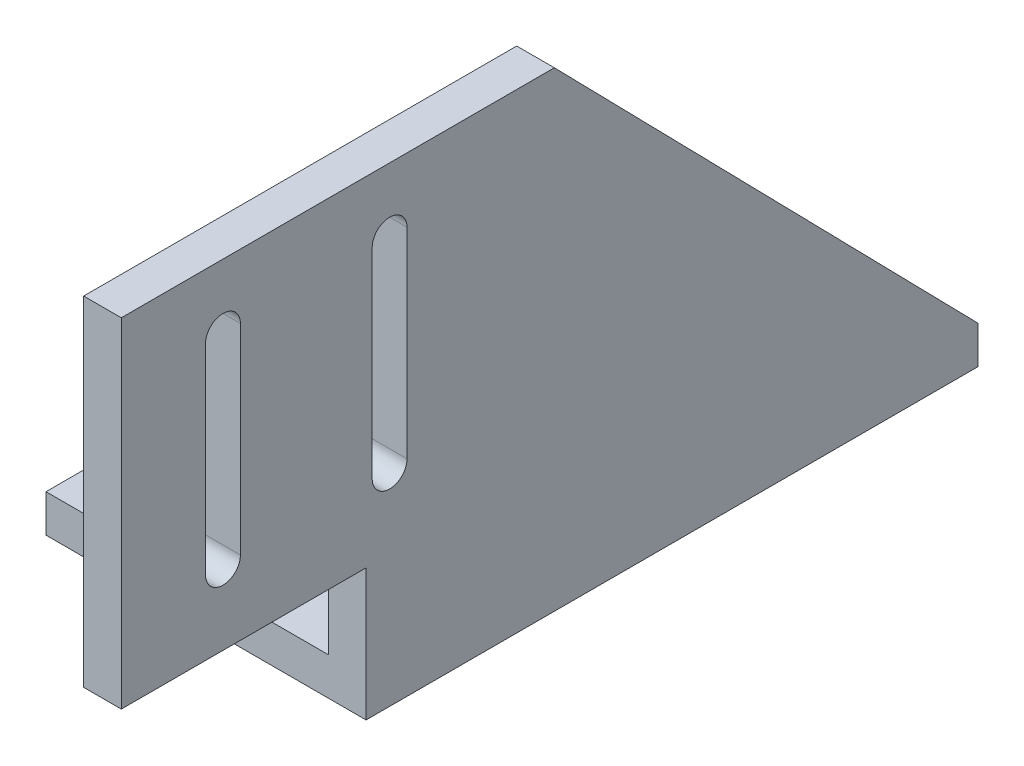
ISO-10303-21;
HEADER;
FILE_DESCRIPTION(('STEP AP214'),'2;1');
FILE_NAME('part.step','',(''),(''),'','','');
FILE_SCHEMA(('AUTOMOTIVE_DESIGN { 1 0 10303 214 1 1 1 1 }'));
ENDSEC;
DATA;
#1=APPLICATION_CONTEXT('core data for automotive mechanical design processes');
#2=APPLICATION_PROTOCOL_DEFINITION('international standard','automotive_design',2000,#1);
#3=PRODUCT_CONTEXT('',#1,'mechanical');
#4=PRODUCT('Part','Part','',(#3));
#5=PRODUCT_RELATED_PRODUCT_CATEGORY('part','',(#4));
#6=PRODUCT_DEFINITION_FORMATION('','',#4);
#7=PRODUCT_DEFINITION_CONTEXT('part definition',#1,'design');
#8=PRODUCT_DEFINITION('design','',#6,#7);
#9=PRODUCT_DEFINITION_SHAPE('','',#8);
#10=(LENGTH_UNIT() NAMED_UNIT(*) SI_UNIT(.MILLI.,.METRE.));
#11=(NAMED_UNIT(*) PLANE_ANGLE_UNIT() SI_UNIT($,.RADIAN.));
#12=(NAMED_UNIT(*) SI_UNIT($,.STERADIAN.) SOLID_ANGLE_UNIT());
#13=UNCERTAINTY_MEASURE_WITH_UNIT(LENGTH_MEASURE(1.E-05),#10,'distance_accuracy_value','');
#14=(GEOMETRIC_REPRESENTATION_CONTEXT(3) GLOBAL_UNCERTAINTY_ASSIGNED_CONTEXT((#13)) GLOBAL_UNIT_ASSIGNED_CONTEXT((#10,
#11,#12)) REPRESENTATION_CONTEXT('',''));
#15=CARTESIAN_POINT('',(0.,0.,0.));
#16=DIRECTION('',(0.,0.,1.));
#17=DIRECTION('',(1.,0.,0.));
#18=AXIS2_PLACEMENT_3D('',#15,#16,#17);
#19=CARTESIAN_POINT('',(0.,-2.,32.5));
#20=DIRECTION('',(1.,0.,0.));
#21=DIRECTION('',(0.,0.,-1.));
#22=AXIS2_PLACEMENT_3D('',#19,#20,#21);
#23=PLANE('',#22);
#24=DIRECTION('',(0.,-1.,0.));
#25=VECTOR('',#24,1.);
#26=CARTESIAN_POINT('',(0.,-2.,0.));
#27=LINE('',#26,#25);
#28=CARTESIAN_POINT('',(0.,0.,0.));
#29=VERTEX_POINT('',#28);
#30=CARTESIAN_POINT('',(0.,-2.,0.));
#31=VERTEX_POINT('',#30);
#32=EDGE_CURVE('E197',#29,#31,#27,.T.);
#33=ORIENTED_EDGE('',*,*,#32,.T.);
#34=DIRECTION('',(0.,0.,-1.));
#35=VECTOR('',#34,1.);
#36=CARTESIAN_POINT('',(0.,-2.,32.5));
#37=LINE('',#36,#35);
#38=CARTESIAN_POINT('',(0.,-2.,32.5));
#39=VERTEX_POINT('',#38);
#40=EDGE_CURVE('E11',#39,#31,#37,.T.);
#41=ORIENTED_EDGE('',*,*,#40,.F.);
#42=DIRECTION('',(0.,-1.,0.));
#43=VECTOR('',#42,1.);
#44=CARTESIAN_POINT('',(0.,-2.,32.5));
#45=LINE('',#44,#43);
#46=CARTESIAN_POINT('',(0.,0.,32.5));
#47=VERTEX_POINT('',#46);
#48=EDGE_CURVE('E163',#47,#39,#45,.T.);
#49=ORIENTED_EDGE('',*,*,#48,.F.);
#50=DIRECTION('',(0.,0.,-1.));
#51=VECTOR('',#50,1.);
#52=CARTESIAN_POINT('',(0.,0.,32.5));
#53=LINE('',#52,#51);
#54=EDGE_CURVE('E189',#47,#29,#53,.T.);
#55=ORIENTED_EDGE('',*,*,#54,.T.);
#56=EDGE_LOOP('',(#33,#41,#49,#55));
#57=FACE_BOUND('',#56,.T.);
#58=ADVANCED_FACE('F43',(#57),#23,.F.);
#59=CARTESIAN_POINT('',(17.,-1.99999999999999,32.5));
#60=DIRECTION('',(0.,1.,0.));
#61=DIRECTION('',(-1.,0.,0.));
#62=AXIS2_PLACEMENT_3D('',#59,#60,#61);
#63=PLANE('',#62);
#64=CARTESIAN_POINT('',(8.,-2.,25.25));
#65=DIRECTION('',(0.,-1.,0.));
#66=DIRECTION('',(1.,0.,0.));
#67=AXIS2_PLACEMENT_3D('',#64,#65,#66);
#68=CIRCLE('',#67,2.75);
#69=CARTESIAN_POINT('',(10.75,-2.,25.25));
#70=VERTEX_POINT('',#69);
#71=EDGE_CURVE('E206',#70,#70,#68,.T.);
#72=ORIENTED_EDGE('',*,*,#71,.F.);
#73=EDGE_LOOP('',(#72));
#74=FACE_BOUND('',#73,.T.);
#75=CARTESIAN_POINT('',(8.,-2.,7.25));
#76=DIRECTION('',(0.,-1.,0.));
#77=DIRECTION('',(1.,0.,0.));
#78=AXIS2_PLACEMENT_3D('',#75,#76,#77);
#79=CIRCLE('',#78,2.75);
#80=CARTESIAN_POINT('',(10.75,-2.,7.25));
#81=VERTEX_POINT('',#80);
#82=EDGE_CURVE('E203',#81,#81,#79,.T.);
#83=ORIENTED_EDGE('',*,*,#82,.F.);
#84=EDGE_LOOP('',(#83));
#85=FACE_BOUND('',#84,.T.);
#86=DIRECTION('',(0.,0.,-1.));
#87=VECTOR('',#86,1.);
#88=CARTESIAN_POINT('',(17.,-1.99999999999999,32.5));
#89=LINE('',#88,#87);
#90=CARTESIAN_POINT('',(17.,-1.99999999999999,32.5));
#91=VERTEX_POINT('',#90);
#92=CARTESIAN_POINT('',(17.,-1.99999999999999,0.));
#93=VERTEX_POINT('',#92);
#94=EDGE_CURVE('E50',#91,#93,#89,.T.);
#95=ORIENTED_EDGE('',*,*,#94,.F.);
#96=DIRECTION('',(1.,0.,0.));
#97=VECTOR('',#96,1.);
#98=CARTESIAN_POINT('',(17.,-1.99999999999999,32.5));
#99=LINE('',#98,#97);
#100=EDGE_CURVE('E158',#39,#91,#99,.T.);
#101=ORIENTED_EDGE('',*,*,#100,.F.);
#102=ORIENTED_EDGE('',*,*,#40,.T.);
#103=DIRECTION('',(1.,0.,0.));
#104=VECTOR('',#103,1.);
#105=CARTESIAN_POINT('',(17.,-1.99999999999999,0.));
#106=LINE('',#105,#104);
#107=EDGE_CURVE('E177',#31,#93,#106,.T.);
#108=ORIENTED_EDGE('',*,*,#107,.T.);
#109=EDGE_LOOP('',(#95,#101,#102,#108));
#110=FACE_BOUND('',#109,.T.);
#111=ADVANCED_FACE('F176',(#74,#85,#110),#63,.F.);
#112=CARTESIAN_POINT('',(17.,23.,32.5));
#113=DIRECTION('',(-1.,0.,0.));
#114=DIRECTION('',(0.,-1.,0.));
#115=AXIS2_PLACEMENT_3D('',#112,#113,#114);
#116=PLANE('',#115);
#117=DIRECTION('',(0.,1.,0.));
#118=VECTOR('',#117,1.);
#119=CARTESIAN_POINT('',(17.,8.92500000000001,39.175));
#120=LINE('',#119,#118);
#121=CARTESIAN_POINT('',(17.,8.92500000000001,39.175));
#122=VERTEX_POINT('',#121);
#123=CARTESIAN_POINT('',(17.,19.575,39.175));
#124=VERTEX_POINT('',#123);
#125=EDGE_CURVE('E282',#122,#124,#120,.T.);
#126=ORIENTED_EDGE('',*,*,#125,.F.);
#127=CARTESIAN_POINT('',(17.,8.92500000000001,40.1));
#128=DIRECTION('',(1.,0.,0.));
#129=DIRECTION('',(0.,1.,0.));
#130=AXIS2_PLACEMENT_3D('',#127,#128,#129);
#131=CIRCLE('',#130,0.925000000000009);
#132=CARTESIAN_POINT('',(17.,8.92500000000001,41.025));
#133=VERTEX_POINT('',#132);
#134=EDGE_CURVE('E65',#133,#122,#131,.T.);
#135=ORIENTED_EDGE('',*,*,#134,.F.);
#136=DIRECTION('',(0.,-1.,0.));
#137=VECTOR('',#136,1.);
#138=CARTESIAN_POINT('',(17.,8.92500000000001,41.025));
#139=LINE('',#138,#137);
#140=CARTESIAN_POINT('',(17.,19.575,41.025));
#141=VERTEX_POINT('',#140);
#142=EDGE_CURVE('E272',#141,#133,#139,.T.);
#143=ORIENTED_EDGE('',*,*,#142,.F.);
#144=CARTESIAN_POINT('',(17.,19.575,40.1));
#145=DIRECTION('',(1.,0.,0.));
#146=DIRECTION('',(0.,1.,0.));
#147=AXIS2_PLACEMENT_3D('',#144,#145,#146);
#148=CIRCLE('',#147,0.925000000000009);
#149=EDGE_CURVE('E279',#124,#141,#148,.T.);
#150=ORIENTED_EDGE('',*,*,#149,.F.);
#151=EDGE_LOOP('',(#126,#135,#143,#150));
#152=FACE_BOUND('',#151,.T.);
#153=DIRECTION('',(0.,1.,0.));
#154=VECTOR('',#153,1.);
#155=CARTESIAN_POINT('',(17.,8.92500000000001,30.325));
#156=LINE('',#155,#154);
#157=CARTESIAN_POINT('',(17.,8.92500000000001,30.325));
#158=VERTEX_POINT('',#157);
#159=CARTESIAN_POINT('',(17.,19.575,30.325));
#160=VERTEX_POINT('',#159);
#161=EDGE_CURVE('E244',#158,#160,#156,.T.);
#162=ORIENTED_EDGE('',*,*,#161,.F.);
#163=CARTESIAN_POINT('',(17.,8.92500000000001,31.25));
#164=DIRECTION('',(1.,0.,0.));
#165=DIRECTION('',(0.,1.,0.));
#166=AXIS2_PLACEMENT_3D('',#163,#164,#165);
#167=CIRCLE('',#166,0.925000000000002);
#168=CARTESIAN_POINT('',(17.,8.92500000000001,32.175));
#169=VERTEX_POINT('',#168);
#170=EDGE_CURVE('E242',#169,#158,#167,.T.);
#171=ORIENTED_EDGE('',*,*,#170,.F.);
#172=DIRECTION('',(0.,-1.,0.));
#173=VECTOR('',#172,1.);
#174=CARTESIAN_POINT('',(17.,8.92500000000001,32.175));
#175=LINE('',#174,#173);
#176=CARTESIAN_POINT('',(17.,19.575,32.175));
#177=VERTEX_POINT('',#176);
#178=EDGE_CURVE('E250',#177,#169,#175,.T.);
#179=ORIENTED_EDGE('',*,*,#178,.F.);
#180=CARTESIAN_POINT('',(17.,19.575,31.25));
#181=DIRECTION('',(1.,0.,0.));
#182=DIRECTION('',(0.,1.,0.));
#183=AXIS2_PLACEMENT_3D('',#180,#181,#182);
#184=CIRCLE('',#183,0.925000000000002);
#185=EDGE_CURVE('E247',#160,#177,#184,.T.);
#186=ORIENTED_EDGE('',*,*,#185,.F.);
#187=EDGE_LOOP('',(#162,#171,#179,#186));
#188=FACE_BOUND('',#187,.T.);
#189=DIRECTION('',(0.,-1.,0.));
#190=VECTOR('',#189,1.);
#191=CARTESIAN_POINT('',(17.,-1.99999999999999,45.5));
#192=LINE('',#191,#190);
#193=CARTESIAN_POINT('',(17.,23.,45.5));
#194=VERTEX_POINT('',#193);
#195=CARTESIAN_POINT('',(17.,5.00000000000001,45.5));
#196=VERTEX_POINT('',#195);
#197=EDGE_CURVE('E228',#194,#196,#192,.T.);
#198=ORIENTED_EDGE('',*,*,#197,.T.);
#199=DIRECTION('',(0.,0.,1.));
#200=VECTOR('',#199,1.);
#201=CARTESIAN_POINT('',(17.,5.00000000000001,45.5));
#202=LINE('',#201,#200);
#203=CARTESIAN_POINT('',(17.,5.00000000000001,32.5));
#204=VERTEX_POINT('',#203);
#205=EDGE_CURVE('E57',#204,#196,#202,.T.);
#206=ORIENTED_EDGE('',*,*,#205,.F.);
#207=DIRECTION('',(0.,1.,0.));
#208=VECTOR('',#207,1.);
#209=CARTESIAN_POINT('',(17.,-1.99999999999999,32.5));
#210=LINE('',#209,#208);
#211=EDGE_CURVE('E161',#91,#204,#210,.T.);
#212=ORIENTED_EDGE('',*,*,#211,.F.);
#213=ORIENTED_EDGE('',*,*,#94,.T.);
#214=DIRECTION('',(0.,1.,0.));
#215=VECTOR('',#214,1.);
#216=CARTESIAN_POINT('',(17.,23.,0.));
#217=LINE('',#216,#215);
#218=CARTESIAN_POINT('',(17.,0.,0.));
#219=VERTEX_POINT('',#218);
#220=EDGE_CURVE('E194',#93,#219,#217,.T.);
#221=ORIENTED_EDGE('',*,*,#220,.T.);
#222=DIRECTION('',(0.,-0.714834025585147,-0.699294155463731));
#223=VECTOR('',#222,1.);
#224=CARTESIAN_POINT('',(17.,23.,22.5));
#225=LINE('',#224,#223);
#226=CARTESIAN_POINT('',(17.,23.,22.5));
#227=VERTEX_POINT('',#226);
#228=EDGE_CURVE('E220',#227,#219,#225,.T.);
#229=ORIENTED_EDGE('',*,*,#228,.F.);
#230=DIRECTION('',(0.,0.,-1.));
#231=VECTOR('',#230,1.);
#232=CARTESIAN_POINT('',(17.,23.,32.5));
#233=LINE('',#232,#231);
#234=EDGE_CURVE('E179',#194,#227,#233,.T.);
#235=ORIENTED_EDGE('',*,*,#234,.F.);
#236=EDGE_LOOP('',(#198,#206,#212,#213,#221,#229,#235));
#237=FACE_BOUND('',#236,.T.);
#238=ADVANCED_FACE('F171',(#152,#188,#237),#116,.F.);
#239=CARTESIAN_POINT('',(15.,23.,32.5));
#240=DIRECTION('',(0.,-1.,0.));
#241=DIRECTION('',(0.,0.,-1.));
#242=AXIS2_PLACEMENT_3D('',#239,#240,#241);
#243=PLANE('',#242);
#244=ORIENTED_EDGE('',*,*,#234,.T.);
#245=DIRECTION('',(1.,0.,0.));
#246=VECTOR('',#245,1.);
#247=CARTESIAN_POINT('',(15.,23.,22.5));
#248=LINE('',#247,#246);
#249=CARTESIAN_POINT('',(15.,23.,22.5));
#250=VERTEX_POINT('',#249);
#251=EDGE_CURVE('E215',#250,#227,#248,.T.);
#252=ORIENTED_EDGE('',*,*,#251,.F.);
#253=DIRECTION('',(0.,0.,-1.));
#254=VECTOR('',#253,1.);
#255=CARTESIAN_POINT('',(15.,23.,32.5));
#256=LINE('',#255,#254);
#257=CARTESIAN_POINT('',(15.,23.,45.5));
#258=VERTEX_POINT('',#257);
#259=EDGE_CURVE('E181',#258,#250,#256,.T.);
#260=ORIENTED_EDGE('',*,*,#259,.F.);
#261=DIRECTION('',(1.,0.,0.));
#262=VECTOR('',#261,1.);
#263=CARTESIAN_POINT('',(15.,23.,45.5));
#264=LINE('',#263,#262);
#265=EDGE_CURVE('E222',#258,#194,#264,.T.);
#266=ORIENTED_EDGE('',*,*,#265,.T.);
#267=EDGE_LOOP('',(#244,#252,#260,#266));
#268=FACE_BOUND('',#267,.T.);
#269=ADVANCED_FACE('F320',(#268),#243,.F.);
#270=CARTESIAN_POINT('',(15.,0.,32.5));
#271=DIRECTION('',(1.,0.,0.));
#272=DIRECTION('',(0.,0.,-1.));
#273=AXIS2_PLACEMENT_3D('',#270,#271,#272);
#274=PLANE('',#273);
#275=DIRECTION('',(0.,1.,0.));
#276=VECTOR('',#275,1.);
#277=CARTESIAN_POINT('',(15.,8.92500000000001,41.025));
#278=LINE('',#277,#276);
#279=CARTESIAN_POINT('',(15.,8.92500000000001,41.025));
#280=VERTEX_POINT('',#279);
#281=CARTESIAN_POINT('',(15.,19.575,41.025));
#282=VERTEX_POINT('',#281);
#283=EDGE_CURVE('E289',#280,#282,#278,.T.);
#284=ORIENTED_EDGE('',*,*,#283,.F.);
#285=CARTESIAN_POINT('',(15.,8.92500000000001,40.1));
#286=DIRECTION('',(1.,0.,0.));
#287=DIRECTION('',(0.,0.,-1.));
#288=AXIS2_PLACEMENT_3D('',#285,#286,#287);
#289=CIRCLE('',#288,0.925000000000009);
#290=CARTESIAN_POINT('',(15.,8.92500000000001,39.175));
#291=VERTEX_POINT('',#290);
#292=EDGE_CURVE('E286',#291,#280,#289,.F.);
#293=ORIENTED_EDGE('',*,*,#292,.F.);
#294=DIRECTION('',(0.,-1.,0.));
#295=VECTOR('',#294,1.);
#296=CARTESIAN_POINT('',(15.,8.92500000000001,39.175));
#297=LINE('',#296,#295);
#298=CARTESIAN_POINT('',(15.,19.575,39.175));
#299=VERTEX_POINT('',#298);
#300=EDGE_CURVE('E230',#299,#291,#297,.T.);
#301=ORIENTED_EDGE('',*,*,#300,.F.);
#302=CARTESIAN_POINT('',(15.,19.575,40.1));
#303=DIRECTION('',(1.,0.,0.));
#304=DIRECTION('',(0.,0.,-1.));
#305=AXIS2_PLACEMENT_3D('',#302,#303,#304);
#306=CIRCLE('',#305,0.925000000000009);
#307=EDGE_CURVE('E235',#282,#299,#306,.F.);
#308=ORIENTED_EDGE('',*,*,#307,.F.);
#309=EDGE_LOOP('',(#284,#293,#301,#308));
#310=FACE_BOUND('',#309,.T.);
#311=DIRECTION('',(0.,1.,0.));
#312=VECTOR('',#311,1.);
#313=CARTESIAN_POINT('',(15.,8.92500000000001,32.175));
#314=LINE('',#313,#312);
#315=CARTESIAN_POINT('',(15.,8.92500000000001,32.175));
#316=VERTEX_POINT('',#315);
#317=CARTESIAN_POINT('',(15.,19.575,32.175));
#318=VERTEX_POINT('',#317);
#319=EDGE_CURVE('E236',#316,#318,#314,.T.);
#320=ORIENTED_EDGE('',*,*,#319,.F.);
#321=CARTESIAN_POINT('',(15.,8.92500000000001,31.25));
#322=DIRECTION('',(1.,0.,0.));
#323=DIRECTION('',(0.,0.,-1.));
#324=AXIS2_PLACEMENT_3D('',#321,#322,#323);
#325=CIRCLE('',#324,0.925000000000002);
#326=CARTESIAN_POINT('',(15.,8.92500000000001,30.325));
#327=VERTEX_POINT('',#326);
#328=EDGE_CURVE('E239',#327,#316,#325,.F.);
#329=ORIENTED_EDGE('',*,*,#328,.F.);
#330=DIRECTION('',(0.,-1.,0.));
#331=VECTOR('',#330,1.);
#332=CARTESIAN_POINT('',(15.,8.92500000000001,30.325));
#333=LINE('',#332,#331);
#334=CARTESIAN_POINT('',(15.,19.575,30.325));
#335=VERTEX_POINT('',#334);
#336=EDGE_CURVE('E257',#335,#327,#333,.T.);
#337=ORIENTED_EDGE('',*,*,#336,.F.);
#338=CARTESIAN_POINT('',(15.,19.575,31.25));
#339=DIRECTION('',(1.,0.,0.));
#340=DIRECTION('',(0.,0.,-1.));
#341=AXIS2_PLACEMENT_3D('',#338,#339,#340);
#342=CIRCLE('',#341,0.925000000000002);
#343=EDGE_CURVE('E233',#318,#335,#342,.F.);
#344=ORIENTED_EDGE('',*,*,#343,.F.);
#345=EDGE_LOOP('',(#320,#329,#337,#344));
#346=FACE_BOUND('',#345,.T.);
#347=DIRECTION('',(0.,-1.,0.));
#348=VECTOR('',#347,1.);
#349=CARTESIAN_POINT('',(15.,-2.,32.5));
#350=LINE('',#349,#348);
#351=CARTESIAN_POINT('',(15.,5.00000000000001,32.5));
#352=VERTEX_POINT('',#351);
#353=CARTESIAN_POINT('',(15.,0.,32.5));
#354=VERTEX_POINT('',#353);
#355=EDGE_CURVE('E265',#352,#354,#350,.T.);
#356=ORIENTED_EDGE('',*,*,#355,.F.);
#357=DIRECTION('',(0.,0.,-1.));
#358=VECTOR('',#357,1.);
#359=CARTESIAN_POINT('',(15.,5.,45.5));
#360=LINE('',#359,#358);
#361=CARTESIAN_POINT('',(15.,5.,45.5));
#362=VERTEX_POINT('',#361);
#363=EDGE_CURVE('E174',#362,#352,#360,.T.);
#364=ORIENTED_EDGE('',*,*,#363,.F.);
#365=DIRECTION('',(0.,-1.,0.));
#366=VECTOR('',#365,1.);
#367=CARTESIAN_POINT('',(15.,-2.,45.5));
#368=LINE('',#367,#366);
#369=EDGE_CURVE('E227',#258,#362,#368,.T.);
#370=ORIENTED_EDGE('',*,*,#369,.F.);
#371=ORIENTED_EDGE('',*,*,#259,.T.);
#372=DIRECTION('',(0.,-0.714834025585147,-0.699294155463731));
#373=VECTOR('',#372,1.);
#374=CARTESIAN_POINT('',(15.,23.,22.5));
#375=LINE('',#374,#373);
#376=CARTESIAN_POINT('',(15.,0.,0.));
#377=VERTEX_POINT('',#376);
#378=EDGE_CURVE('E217',#250,#377,#375,.T.);
#379=ORIENTED_EDGE('',*,*,#378,.T.);
#380=DIRECTION('',(0.,0.,-1.));
#381=VECTOR('',#380,1.);
#382=CARTESIAN_POINT('',(15.,0.,32.5));
#383=LINE('',#382,#381);
#384=EDGE_CURVE('E186',#354,#377,#383,.T.);
#385=ORIENTED_EDGE('',*,*,#384,.F.);
#386=EDGE_LOOP('',(#356,#364,#370,#371,#379,#385));
#387=FACE_BOUND('',#386,.T.);
#388=ADVANCED_FACE('F306',(#310,#346,#387),#274,.F.);
#389=CARTESIAN_POINT('',(0.,0.,32.5));
#390=DIRECTION('',(0.,-1.,0.));
#391=DIRECTION('',(0.,0.,-1.));
#392=AXIS2_PLACEMENT_3D('',#389,#390,#391);
#393=PLANE('',#392);
#394=CARTESIAN_POINT('',(8.,0.,25.25));
#395=DIRECTION('',(0.,-1.,0.));
#396=DIRECTION('',(0.,0.,-1.));
#397=AXIS2_PLACEMENT_3D('',#394,#395,#396);
#398=CIRCLE('',#397,2.75);
#399=CARTESIAN_POINT('',(8.,0.,22.5));
#400=VERTEX_POINT('',#399);
#401=EDGE_CURVE('E200',#400,#400,#398,.F.);
#402=ORIENTED_EDGE('',*,*,#401,.F.);
#403=EDGE_LOOP('',(#402));
#404=FACE_BOUND('',#403,.T.);
#405=CARTESIAN_POINT('',(8.,0.,7.25));
#406=DIRECTION('',(0.,-1.,0.));
#407=DIRECTION('',(0.,0.,-1.));
#408=AXIS2_PLACEMENT_3D('',#405,#406,#407);
#409=CIRCLE('',#408,2.75);
#410=CARTESIAN_POINT('',(8.,0.,4.5));
#411=VERTEX_POINT('',#410);
#412=EDGE_CURVE('E207',#411,#411,#409,.F.);
#413=ORIENTED_EDGE('',*,*,#412,.F.);
#414=EDGE_LOOP('',(#413));
#415=FACE_BOUND('',#414,.T.);
#416=DIRECTION('',(-1.,0.,0.));
#417=VECTOR('',#416,1.);
#418=CARTESIAN_POINT('',(0.,0.,0.));
#419=LINE('',#418,#417);
#420=EDGE_CURVE('E192',#377,#29,#419,.T.);
#421=ORIENTED_EDGE('',*,*,#420,.T.);
#422=ORIENTED_EDGE('',*,*,#54,.F.);
#423=DIRECTION('',(-1.,0.,0.));
#424=VECTOR('',#423,1.);
#425=CARTESIAN_POINT('',(0.,0.,32.5));
#426=LINE('',#425,#424);
#427=EDGE_CURVE('E167',#354,#47,#426,.T.);
#428=ORIENTED_EDGE('',*,*,#427,.F.);
#429=ORIENTED_EDGE('',*,*,#384,.T.);
#430=EDGE_LOOP('',(#421,#422,#428,#429));
#431=FACE_BOUND('',#430,.T.);
#432=ADVANCED_FACE('F310',(#404,#415,#431),#393,.F.);
#433=CARTESIAN_POINT('',(0.,0.,32.5));
#434=DIRECTION('',(0.,0.,-1.));
#435=DIRECTION('',(-1.,0.,0.));
#436=AXIS2_PLACEMENT_3D('',#433,#434,#435);
#437=PLANE('',#436);
#438=ORIENTED_EDGE('',*,*,#100,.T.);
#439=ORIENTED_EDGE('',*,*,#211,.T.);
#440=DIRECTION('',(1.,0.,0.));
#441=VECTOR('',#440,1.);
#442=CARTESIAN_POINT('',(-0.001000000000001,5.,32.5));
#443=LINE('',#442,#441);
#444=EDGE_CURVE('E295',#352,#204,#443,.T.);
#445=ORIENTED_EDGE('',*,*,#444,.F.);
#446=ORIENTED_EDGE('',*,*,#355,.T.);
#447=ORIENTED_EDGE('',*,*,#427,.T.);
#448=ORIENTED_EDGE('',*,*,#48,.T.);
#449=EDGE_LOOP('',(#438,#439,#445,#446,#447,#448));
#450=FACE_BOUND('',#449,.T.);
#451=ADVANCED_FACE('F160',(#450),#437,.F.);
#452=CARTESIAN_POINT('',(0.,0.,0.));
#453=DIRECTION('',(0.,0.,-1.));
#454=DIRECTION('',(-1.,0.,0.));
#455=AXIS2_PLACEMENT_3D('',#452,#453,#454);
#456=PLANE('',#455);
#457=DIRECTION('',(1.,0.,0.));
#458=VECTOR('',#457,1.);
#459=CARTESIAN_POINT('',(15.,0.,0.));
#460=LINE('',#459,#458);
#461=EDGE_CURVE('E210',#377,#219,#460,.T.);
#462=ORIENTED_EDGE('',*,*,#461,.T.);
#463=ORIENTED_EDGE('',*,*,#220,.F.);
#464=ORIENTED_EDGE('',*,*,#107,.F.);
#465=ORIENTED_EDGE('',*,*,#32,.F.);
#466=ORIENTED_EDGE('',*,*,#420,.F.);
#467=EDGE_LOOP('',(#462,#463,#464,#465,#466));
#468=FACE_BOUND('',#467,.T.);
#469=ADVANCED_FACE('F315',(#468),#456,.T.);
#470=CARTESIAN_POINT('',(8.,7.77817459305202,7.25));
#471=DIRECTION('',(0.,-1.,0.));
#472=DIRECTION('',(1.,0.,0.));
#473=AXIS2_PLACEMENT_3D('',#470,#471,#472);
#474=CYLINDRICAL_SURFACE('',#473,2.75);
#475=ORIENTED_EDGE('',*,*,#412,.T.);
#476=EDGE_LOOP('',(#475));
#477=FACE_BOUND('',#476,.T.);
#478=ORIENTED_EDGE('',*,*,#82,.T.);
#479=EDGE_LOOP('',(#478));
#480=FACE_BOUND('',#479,.T.);
#481=ADVANCED_FACE('F337',(#477,#480),#474,.F.);
#482=CARTESIAN_POINT('',(8.,7.77817459305202,25.25));
#483=DIRECTION('',(0.,-1.,0.));
#484=DIRECTION('',(1.,0.,0.));
#485=AXIS2_PLACEMENT_3D('',#482,#483,#484);
#486=CYLINDRICAL_SURFACE('',#485,2.75);
#487=ORIENTED_EDGE('',*,*,#401,.T.);
#488=EDGE_LOOP('',(#487));
#489=FACE_BOUND('',#488,.T.);
#490=ORIENTED_EDGE('',*,*,#71,.T.);
#491=EDGE_LOOP('',(#490));
#492=FACE_BOUND('',#491,.T.);
#493=ADVANCED_FACE('F327',(#489,#492),#486,.F.);
#494=CARTESIAN_POINT('',(15.,23.,22.5));
#495=DIRECTION('',(0.,-0.699294155463731,0.714834025585147));
#496=DIRECTION('',(0.,-0.714834025585147,-0.699294155463731));
#497=AXIS2_PLACEMENT_3D('',#494,#495,#496);
#498=PLANE('',#497);
#499=ORIENTED_EDGE('',*,*,#228,.T.);
#500=ORIENTED_EDGE('',*,*,#461,.F.);
#501=ORIENTED_EDGE('',*,*,#378,.F.);
#502=ORIENTED_EDGE('',*,*,#251,.T.);
#503=EDGE_LOOP('',(#499,#500,#501,#502));
#504=FACE_BOUND('',#503,.T.);
#505=ADVANCED_FACE('F325',(#504),#498,.F.);
#506=CARTESIAN_POINT('',(15.,-2.,45.5));
#507=DIRECTION('',(0.,0.,1.));
#508=DIRECTION('',(1.,0.,0.));
#509=AXIS2_PLACEMENT_3D('',#506,#507,#508);
#510=PLANE('',#509);
#511=DIRECTION('',(1.,0.,0.));
#512=VECTOR('',#511,1.);
#513=CARTESIAN_POINT('',(-0.001000000000001,5.,45.5));
#514=LINE('',#513,#512);
#515=EDGE_CURVE('E294',#362,#196,#514,.T.);
#516=ORIENTED_EDGE('',*,*,#515,.T.);
#517=ORIENTED_EDGE('',*,*,#197,.F.);
#518=ORIENTED_EDGE('',*,*,#265,.F.);
#519=ORIENTED_EDGE('',*,*,#369,.T.);
#520=EDGE_LOOP('',(#516,#517,#518,#519));
#521=FACE_BOUND('',#520,.T.);
#522=ADVANCED_FACE('F324',(#521),#510,.T.);
#523=CARTESIAN_POINT('',(-0.001000000000001,8.92500000000001,31.25));
#524=DIRECTION('',(1.,0.,0.));
#525=DIRECTION('',(0.,1.,0.));
#526=AXIS2_PLACEMENT_3D('',#523,#524,#525);
#527=CYLINDRICAL_SURFACE('',#526,0.925000000000002);
#528=ORIENTED_EDGE('',*,*,#328,.T.);
#529=DIRECTION('',(1.,0.,0.));
#530=VECTOR('',#529,1.);
#531=CARTESIAN_POINT('',(-0.001000000000001,8.92500000000001,32.175));
#532=LINE('',#531,#530);
#533=EDGE_CURVE('E254',#316,#169,#532,.T.);
#534=ORIENTED_EDGE('',*,*,#533,.T.);
#535=ORIENTED_EDGE('',*,*,#170,.T.);
#536=DIRECTION('',(1.,0.,0.));
#537=VECTOR('',#536,1.);
#538=CARTESIAN_POINT('',(-0.001000000000001,8.92500000000001,30.325));
#539=LINE('',#538,#537);
#540=EDGE_CURVE('E253',#327,#158,#539,.T.);
#541=ORIENTED_EDGE('',*,*,#540,.F.);
#542=EDGE_LOOP('',(#528,#534,#535,#541));
#543=FACE_BOUND('',#542,.T.);
#544=ADVANCED_FACE('F334',(#543),#527,.F.);
#545=CARTESIAN_POINT('',(-0.001000000000001,8.92500000000001,32.175));
#546=DIRECTION('',(0.,0.,1.));
#547=DIRECTION('',(1.,0.,0.));
#548=AXIS2_PLACEMENT_3D('',#545,#546,#547);
#549=PLANE('',#548);
#550=ORIENTED_EDGE('',*,*,#319,.T.);
#551=DIRECTION('',(1.,0.,0.));
#552=VECTOR('',#551,1.);
#553=CARTESIAN_POINT('',(-0.00100000000000447,19.575,32.175));
#554=LINE('',#553,#552);
#555=EDGE_CURVE('E256',#318,#177,#554,.T.);
#556=ORIENTED_EDGE('',*,*,#555,.T.);
#557=ORIENTED_EDGE('',*,*,#178,.T.);
#558=ORIENTED_EDGE('',*,*,#533,.F.);
#559=EDGE_LOOP('',(#550,#556,#557,#558));
#560=FACE_BOUND('',#559,.T.);
#561=ADVANCED_FACE('F452',(#560),#549,.F.);
#562=CARTESIAN_POINT('',(-0.00100000000000447,19.575,31.25));
#563=DIRECTION('',(1.,0.,0.));
#564=DIRECTION('',(0.,1.,0.));
#565=AXIS2_PLACEMENT_3D('',#562,#563,#564);
#566=CYLINDRICAL_SURFACE('',#565,0.925000000000002);
#567=ORIENTED_EDGE('',*,*,#343,.T.);
#568=DIRECTION('',(1.,0.,0.));
#569=VECTOR('',#568,1.);
#570=CARTESIAN_POINT('',(-0.00100000000000447,19.575,30.325));
#571=LINE('',#570,#569);
#572=EDGE_CURVE('E259',#335,#160,#571,.T.);
#573=ORIENTED_EDGE('',*,*,#572,.T.);
#574=ORIENTED_EDGE('',*,*,#185,.T.);
#575=ORIENTED_EDGE('',*,*,#555,.F.);
#576=EDGE_LOOP('',(#567,#573,#574,#575));
#577=FACE_BOUND('',#576,.T.);
#578=ADVANCED_FACE('F461',(#577),#566,.F.);
#579=CARTESIAN_POINT('',(-0.001000000000001,8.92500000000001,30.325));
#580=DIRECTION('',(0.,0.,-1.));
#581=DIRECTION('',(-1.,0.,0.));
#582=AXIS2_PLACEMENT_3D('',#579,#580,#581);
#583=PLANE('',#582);
#584=ORIENTED_EDGE('',*,*,#336,.T.);
#585=ORIENTED_EDGE('',*,*,#540,.T.);
#586=ORIENTED_EDGE('',*,*,#161,.T.);
#587=ORIENTED_EDGE('',*,*,#572,.F.);
#588=EDGE_LOOP('',(#584,#585,#586,#587));
#589=FACE_BOUND('',#588,.T.);
#590=ADVANCED_FACE('F470',(#589),#583,.F.);
#591=CARTESIAN_POINT('',(-0.001000000000001,8.92500000000001,40.1));
#592=DIRECTION('',(1.,0.,0.));
#593=DIRECTION('',(0.,1.,0.));
#594=AXIS2_PLACEMENT_3D('',#591,#592,#593);
#595=CYLINDRICAL_SURFACE('',#594,0.925000000000009);
#596=ORIENTED_EDGE('',*,*,#292,.T.);
#597=DIRECTION('',(1.,0.,0.));
#598=VECTOR('',#597,1.);
#599=CARTESIAN_POINT('',(-0.001000000000001,8.92500000000001,41.025));
#600=LINE('',#599,#598);
#601=EDGE_CURVE('E268',#280,#133,#600,.T.);
#602=ORIENTED_EDGE('',*,*,#601,.T.);
#603=ORIENTED_EDGE('',*,*,#134,.T.);
#604=DIRECTION('',(1.,0.,0.));
#605=VECTOR('',#604,1.);
#606=CARTESIAN_POINT('',(-0.001000000000001,8.92500000000001,39.175));
#607=LINE('',#606,#605);
#608=EDGE_CURVE('E269',#291,#122,#607,.T.);
#609=ORIENTED_EDGE('',*,*,#608,.F.);
#610=EDGE_LOOP('',(#596,#602,#603,#609));
#611=FACE_BOUND('',#610,.T.);
#612=ADVANCED_FACE('F479',(#611),#595,.F.);
#613=CARTESIAN_POINT('',(-0.001000000000001,8.92500000000001,41.025));
#614=DIRECTION('',(0.,0.,1.));
#615=DIRECTION('',(1.,0.,0.));
#616=AXIS2_PLACEMENT_3D('',#613,#614,#615);
#617=PLANE('',#616);
#618=ORIENTED_EDGE('',*,*,#283,.T.);
#619=DIRECTION('',(1.,0.,0.));
#620=VECTOR('',#619,1.);
#621=CARTESIAN_POINT('',(-0.00100000000000447,19.575,41.025));
#622=LINE('',#621,#620);
#623=EDGE_CURVE('E274',#282,#141,#622,.T.);
#624=ORIENTED_EDGE('',*,*,#623,.T.);
#625=ORIENTED_EDGE('',*,*,#142,.T.);
#626=ORIENTED_EDGE('',*,*,#601,.F.);
#627=EDGE_LOOP('',(#618,#624,#625,#626));
#628=FACE_BOUND('',#627,.T.);
#629=ADVANCED_FACE('F488',(#628),#617,.F.);
#630=CARTESIAN_POINT('',(-0.00100000000000447,19.575,40.1));
#631=DIRECTION('',(1.,0.,0.));
#632=DIRECTION('',(0.,1.,0.));
#633=AXIS2_PLACEMENT_3D('',#630,#631,#632);
#634=CYLINDRICAL_SURFACE('',#633,0.925000000000009);
#635=ORIENTED_EDGE('',*,*,#307,.T.);
#636=DIRECTION('',(1.,0.,0.));
#637=VECTOR('',#636,1.);
#638=CARTESIAN_POINT('',(-0.00100000000000447,19.575,39.175));
#639=LINE('',#638,#637);
#640=EDGE_CURVE('E271',#299,#124,#639,.T.);
#641=ORIENTED_EDGE('',*,*,#640,.T.);
#642=ORIENTED_EDGE('',*,*,#149,.T.);
#643=ORIENTED_EDGE('',*,*,#623,.F.);
#644=EDGE_LOOP('',(#635,#641,#642,#643));
#645=FACE_BOUND('',#644,.T.);
#646=ADVANCED_FACE('F496',(#645),#634,.F.);
#647=CARTESIAN_POINT('',(-0.001000000000001,8.92500000000001,39.175));
#648=DIRECTION('',(0.,0.,-1.));
#649=DIRECTION('',(-1.,0.,0.));
#650=AXIS2_PLACEMENT_3D('',#647,#648,#649);
#651=PLANE('',#650);
#652=ORIENTED_EDGE('',*,*,#300,.T.);
#653=ORIENTED_EDGE('',*,*,#608,.T.);
#654=ORIENTED_EDGE('',*,*,#125,.T.);
#655=ORIENTED_EDGE('',*,*,#640,.F.);
#656=EDGE_LOOP('',(#652,#653,#654,#655));
#657=FACE_BOUND('',#656,.T.);
#658=ADVANCED_FACE('F505',(#657),#651,.F.);
#659=CARTESIAN_POINT('',(-0.001000000000001,5.,45.5));
#660=DIRECTION('',(0.,1.,0.));
#661=DIRECTION('',(-1.,0.,0.));
#662=AXIS2_PLACEMENT_3D('',#659,#660,#661);
#663=PLANE('',#662);
#664=ORIENTED_EDGE('',*,*,#363,.T.);
#665=ORIENTED_EDGE('',*,*,#444,.T.);
#666=ORIENTED_EDGE('',*,*,#205,.T.);
#667=ORIENTED_EDGE('',*,*,#515,.F.);
#668=EDGE_LOOP('',(#664,#665,#666,#667));
#669=FACE_BOUND('',#668,.T.);
#670=ADVANCED_FACE('F302',(#669),#663,.F.);
#671=CLOSED_SHELL('',(#58,#111,#238,#269,#388,#432,#451,#469,#481,#493,#505,#522,#544,#561,#578,
#590,#612,#629,#646,#658,#670));
#672=MANIFOLD_SOLID_BREP('B2',#671);
#673=ADVANCED_BREP_SHAPE_REPRESENTATION('',(#18,#672),#14);
#674=SHAPE_DEFINITION_REPRESENTATION(#9,#673);
ENDSEC;
END-ISO-10303-21;
